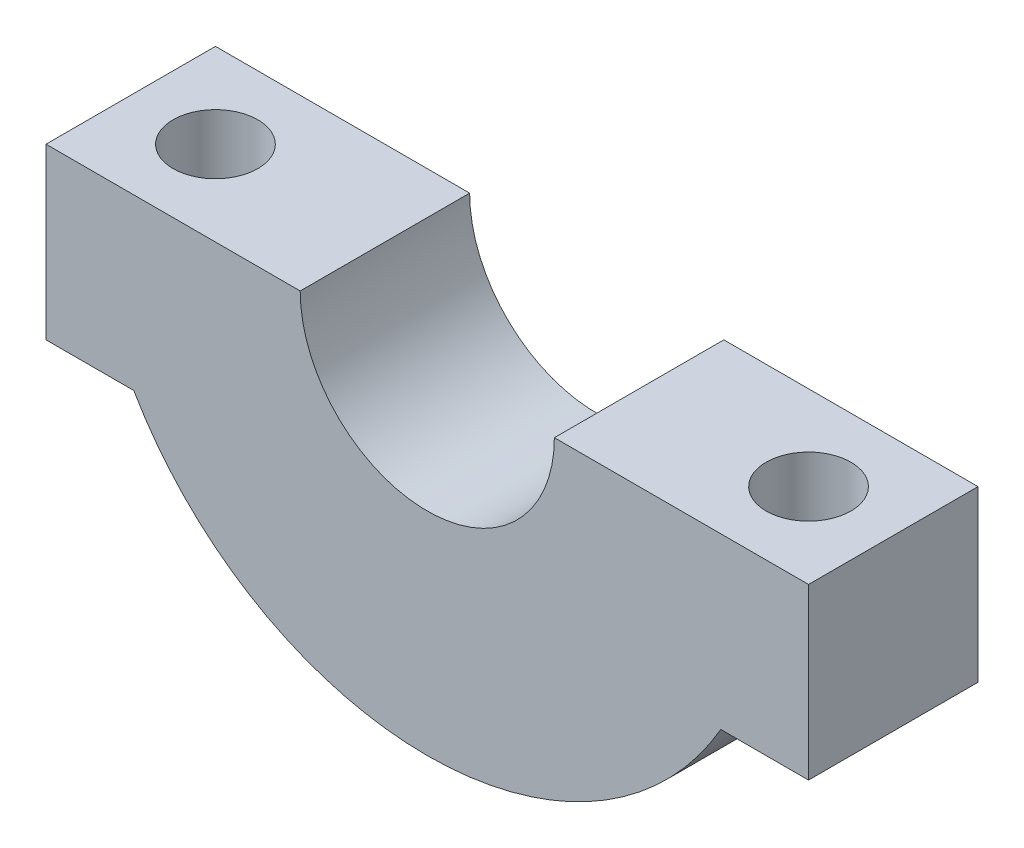
ISO-10303-21;
HEADER;
FILE_DESCRIPTION(('STEP AP214'),'2;1');
FILE_NAME('part.step','',(''),(''),'','','');
FILE_SCHEMA(('AUTOMOTIVE_DESIGN { 1 0 10303 214 1 1 1 1 }'));
ENDSEC;
DATA;
#1=APPLICATION_CONTEXT('core data for automotive mechanical design processes');
#2=APPLICATION_PROTOCOL_DEFINITION('international standard','automotive_design',2000,#1);
#3=PRODUCT_CONTEXT('',#1,'mechanical');
#4=PRODUCT('Part','Part','',(#3));
#5=PRODUCT_RELATED_PRODUCT_CATEGORY('part','',(#4));
#6=PRODUCT_DEFINITION_FORMATION('','',#4);
#7=PRODUCT_DEFINITION_CONTEXT('part definition',#1,'design');
#8=PRODUCT_DEFINITION('design','',#6,#7);
#9=PRODUCT_DEFINITION_SHAPE('','',#8);
#10=(LENGTH_UNIT() NAMED_UNIT(*) SI_UNIT(.MILLI.,.METRE.));
#11=(NAMED_UNIT(*) PLANE_ANGLE_UNIT() SI_UNIT($,.RADIAN.));
#12=(NAMED_UNIT(*) SI_UNIT($,.STERADIAN.) SOLID_ANGLE_UNIT());
#13=UNCERTAINTY_MEASURE_WITH_UNIT(LENGTH_MEASURE(1.E-05),#10,'distance_accuracy_value','');
#14=(GEOMETRIC_REPRESENTATION_CONTEXT(3) GLOBAL_UNCERTAINTY_ASSIGNED_CONTEXT((#13)) GLOBAL_UNIT_ASSIGNED_CONTEXT((#10,
#11,#12)) REPRESENTATION_CONTEXT('',''));
#15=CARTESIAN_POINT('',(0.,0.,0.));
#16=DIRECTION('',(0.,0.,1.));
#17=DIRECTION('',(1.,0.,0.));
#18=AXIS2_PLACEMENT_3D('',#15,#16,#17);
#19=CARTESIAN_POINT('',(45.,0.,20.));
#20=DIRECTION('',(-1.,0.,0.));
#21=DIRECTION('',(0.,0.,1.));
#22=AXIS2_PLACEMENT_3D('',#19,#20,#21);
#23=PLANE('',#22);
#24=DIRECTION('',(0.,1.,0.));
#25=VECTOR('',#24,1.);
#26=CARTESIAN_POINT('',(45.,0.,0.));
#27=LINE('',#26,#25);
#28=CARTESIAN_POINT('',(45.,-20.,0.));
#29=VERTEX_POINT('',#28);
#30=CARTESIAN_POINT('',(45.,0.,0.));
#31=VERTEX_POINT('',#30);
#32=EDGE_CURVE('E216',#29,#31,#27,.T.);
#33=ORIENTED_EDGE('',*,*,#32,.T.);
#34=DIRECTION('',(0.,0.,-1.));
#35=VECTOR('',#34,1.);
#36=CARTESIAN_POINT('',(45.,0.,20.));
#37=LINE('',#36,#35);
#38=CARTESIAN_POINT('',(45.,0.,20.));
#39=VERTEX_POINT('',#38);
#40=EDGE_CURVE('E174',#39,#31,#37,.T.);
#41=ORIENTED_EDGE('',*,*,#40,.F.);
#42=DIRECTION('',(0.,1.,0.));
#43=VECTOR('',#42,1.);
#44=CARTESIAN_POINT('',(45.,0.,20.));
#45=LINE('',#44,#43);
#46=CARTESIAN_POINT('',(45.,-20.,20.));
#47=VERTEX_POINT('',#46);
#48=EDGE_CURVE('E246',#47,#39,#45,.T.);
#49=ORIENTED_EDGE('',*,*,#48,.F.);
#50=DIRECTION('',(0.,0.,-1.));
#51=VECTOR('',#50,1.);
#52=CARTESIAN_POINT('',(45.,-20.,20.));
#53=LINE('',#52,#51);
#54=EDGE_CURVE('E144',#47,#29,#53,.T.);
#55=ORIENTED_EDGE('',*,*,#54,.T.);
#56=EDGE_LOOP('',(#33,#41,#49,#55));
#57=FACE_BOUND('',#56,.T.);
#58=ADVANCED_FACE('F45',(#57),#23,.F.);
#59=CARTESIAN_POINT('',(15.,0.,20.));
#60=DIRECTION('',(0.,-1.,0.));
#61=DIRECTION('',(0.,0.,-1.));
#62=AXIS2_PLACEMENT_3D('',#59,#60,#61);
#63=PLANE('',#62);
#64=CARTESIAN_POINT('',(35.,0.,10.));
#65=DIRECTION('',(0.,1.,0.));
#66=DIRECTION('',(0.,0.,1.));
#67=AXIS2_PLACEMENT_3D('',#64,#65,#66);
#68=CIRCLE('',#67,4.99999999999999);
#69=CARTESIAN_POINT('',(35.,0.,15.));
#70=VERTEX_POINT('',#69);
#71=EDGE_CURVE('E137',#70,#70,#68,.T.);
#72=ORIENTED_EDGE('',*,*,#71,.F.);
#73=EDGE_LOOP('',(#72));
#74=FACE_BOUND('',#73,.T.);
#75=DIRECTION('',(-1.,0.,0.));
#76=VECTOR('',#75,1.);
#77=CARTESIAN_POINT('',(15.,0.,0.));
#78=LINE('',#77,#76);
#79=CARTESIAN_POINT('',(15.,0.,0.));
#80=VERTEX_POINT('',#79);
#81=EDGE_CURVE('E220',#31,#80,#78,.T.);
#82=ORIENTED_EDGE('',*,*,#81,.T.);
#83=DIRECTION('',(0.,0.,-1.));
#84=VECTOR('',#83,1.);
#85=CARTESIAN_POINT('',(15.,0.,20.));
#86=LINE('',#85,#84);
#87=CARTESIAN_POINT('',(15.,0.,20.));
#88=VERTEX_POINT('',#87);
#89=EDGE_CURVE('E170',#88,#80,#86,.T.);
#90=ORIENTED_EDGE('',*,*,#89,.F.);
#91=DIRECTION('',(-1.,0.,0.));
#92=VECTOR('',#91,1.);
#93=CARTESIAN_POINT('',(15.,0.,20.));
#94=LINE('',#93,#92);
#95=EDGE_CURVE('E249',#39,#88,#94,.T.);
#96=ORIENTED_EDGE('',*,*,#95,.F.);
#97=ORIENTED_EDGE('',*,*,#40,.T.);
#98=EDGE_LOOP('',(#82,#90,#96,#97));
#99=FACE_BOUND('',#98,.T.);
#100=ADVANCED_FACE('F205',(#74,#99),#63,.F.);
#101=CARTESIAN_POINT('',(0.,0.,20.));
#102=DIRECTION('',(0.,0.,-1.));
#103=DIRECTION('',(-1.,0.,0.));
#104=AXIS2_PLACEMENT_3D('',#101,#102,#103);
#105=CYLINDRICAL_SURFACE('',#104,15.);
#106=CARTESIAN_POINT('',(0.,0.,0.));
#107=DIRECTION('',(0.,0.,-1.));
#108=DIRECTION('',(1.,0.,0.));
#109=AXIS2_PLACEMENT_3D('',#106,#107,#108);
#110=CIRCLE('',#109,15.);
#111=CARTESIAN_POINT('',(-15.,0.,0.));
#112=VERTEX_POINT('',#111);
#113=EDGE_CURVE('E224',#80,#112,#110,.T.);
#114=ORIENTED_EDGE('',*,*,#113,.T.);
#115=DIRECTION('',(0.,0.,-1.));
#116=VECTOR('',#115,1.);
#117=CARTESIAN_POINT('',(-15.,0.,20.));
#118=LINE('',#117,#116);
#119=CARTESIAN_POINT('',(-15.,0.,20.));
#120=VERTEX_POINT('',#119);
#121=EDGE_CURVE('E166',#120,#112,#118,.T.);
#122=ORIENTED_EDGE('',*,*,#121,.F.);
#123=CARTESIAN_POINT('',(0.,0.,20.));
#124=DIRECTION('',(0.,0.,-1.));
#125=DIRECTION('',(1.,0.,0.));
#126=AXIS2_PLACEMENT_3D('',#123,#124,#125);
#127=CIRCLE('',#126,15.);
#128=EDGE_CURVE('E252',#88,#120,#127,.T.);
#129=ORIENTED_EDGE('',*,*,#128,.F.);
#130=ORIENTED_EDGE('',*,*,#89,.T.);
#131=EDGE_LOOP('',(#114,#122,#129,#130));
#132=FACE_BOUND('',#131,.T.);
#133=ADVANCED_FACE('F211',(#132),#105,.F.);
#134=CARTESIAN_POINT('',(-15.,0.,20.));
#135=DIRECTION('',(0.,-1.,0.));
#136=DIRECTION('',(1.,0.,0.));
#137=AXIS2_PLACEMENT_3D('',#134,#135,#136);
#138=PLANE('',#137);
#139=CARTESIAN_POINT('',(-35.,0.,10.));
#140=DIRECTION('',(0.,1.,0.));
#141=DIRECTION('',(0.,0.,1.));
#142=AXIS2_PLACEMENT_3D('',#139,#140,#141);
#143=CIRCLE('',#142,4.99999999999999);
#144=CARTESIAN_POINT('',(-35.,0.,15.));
#145=VERTEX_POINT('',#144);
#146=EDGE_CURVE('E136',#145,#145,#143,.T.);
#147=ORIENTED_EDGE('',*,*,#146,.F.);
#148=EDGE_LOOP('',(#147));
#149=FACE_BOUND('',#148,.T.);
#150=DIRECTION('',(-1.,0.,0.));
#151=VECTOR('',#150,1.);
#152=CARTESIAN_POINT('',(-15.,0.,0.));
#153=LINE('',#152,#151);
#154=CARTESIAN_POINT('',(-45.,0.,0.));
#155=VERTEX_POINT('',#154);
#156=EDGE_CURVE('E232',#112,#155,#153,.T.);
#157=ORIENTED_EDGE('',*,*,#156,.T.);
#158=DIRECTION('',(0.,0.,-1.));
#159=VECTOR('',#158,1.);
#160=CARTESIAN_POINT('',(-45.,0.,20.));
#161=LINE('',#160,#159);
#162=CARTESIAN_POINT('',(-45.,0.,20.));
#163=VERTEX_POINT('',#162);
#164=EDGE_CURVE('E162',#163,#155,#161,.T.);
#165=ORIENTED_EDGE('',*,*,#164,.F.);
#166=DIRECTION('',(-1.,0.,0.));
#167=VECTOR('',#166,1.);
#168=CARTESIAN_POINT('',(-15.,0.,20.));
#169=LINE('',#168,#167);
#170=EDGE_CURVE('E258',#120,#163,#169,.T.);
#171=ORIENTED_EDGE('',*,*,#170,.F.);
#172=ORIENTED_EDGE('',*,*,#121,.T.);
#173=EDGE_LOOP('',(#157,#165,#171,#172));
#174=FACE_BOUND('',#173,.T.);
#175=ADVANCED_FACE('F284',(#149,#174),#138,.F.);
#176=CARTESIAN_POINT('',(-45.,0.,20.));
#177=DIRECTION('',(1.,0.,0.));
#178=DIRECTION('',(0.,0.,-1.));
#179=AXIS2_PLACEMENT_3D('',#176,#177,#178);
#180=PLANE('',#179);
#181=DIRECTION('',(0.,-1.,0.));
#182=VECTOR('',#181,1.);
#183=CARTESIAN_POINT('',(-45.,0.,0.));
#184=LINE('',#183,#182);
#185=CARTESIAN_POINT('',(-45.,-20.,0.));
#186=VERTEX_POINT('',#185);
#187=EDGE_CURVE('E235',#155,#186,#184,.T.);
#188=ORIENTED_EDGE('',*,*,#187,.T.);
#189=DIRECTION('',(0.,0.,-1.));
#190=VECTOR('',#189,1.);
#191=CARTESIAN_POINT('',(-45.,-20.,20.));
#192=LINE('',#191,#190);
#193=CARTESIAN_POINT('',(-45.,-20.,20.));
#194=VERTEX_POINT('',#193);
#195=EDGE_CURVE('E158',#194,#186,#192,.T.);
#196=ORIENTED_EDGE('',*,*,#195,.F.);
#197=DIRECTION('',(0.,-1.,0.));
#198=VECTOR('',#197,1.);
#199=CARTESIAN_POINT('',(-45.,0.,20.));
#200=LINE('',#199,#198);
#201=EDGE_CURVE('E261',#163,#194,#200,.T.);
#202=ORIENTED_EDGE('',*,*,#201,.F.);
#203=ORIENTED_EDGE('',*,*,#164,.T.);
#204=EDGE_LOOP('',(#188,#196,#202,#203));
#205=FACE_BOUND('',#204,.T.);
#206=ADVANCED_FACE('F279',(#205),#180,.F.);
#207=CARTESIAN_POINT('',(-39.4235163991571,-20.,20.));
#208=DIRECTION('',(0.,1.,0.));
#209=DIRECTION('',(0.,0.,1.));
#210=AXIS2_PLACEMENT_3D('',#207,#208,#209);
#211=PLANE('',#210);
#212=DIRECTION('',(0.,0.,-1.));
#213=VECTOR('',#212,1.);
#214=CARTESIAN_POINT('',(-34.6410161513775,-20.,20.));
#215=LINE('',#214,#213);
#216=CARTESIAN_POINT('',(-34.6410161513775,-20.,5.01290359062229));
#217=VERTEX_POINT('',#216);
#218=CARTESIAN_POINT('',(-34.6410161513775,-20.,0.));
#219=VERTEX_POINT('',#218);
#220=EDGE_CURVE('E148',#217,#219,#215,.T.);
#221=ORIENTED_EDGE('',*,*,#220,.F.);
#222=CARTESIAN_POINT('',(-35.,-20.,10.));
#223=DIRECTION('',(0.,1.,0.));
#224=DIRECTION('',(0.,0.,1.));
#225=AXIS2_PLACEMENT_3D('',#222,#223,#224);
#226=CIRCLE('',#225,4.99999999999999);
#227=CARTESIAN_POINT('',(-34.6410161513775,-20.,14.9870964093777));
#228=VERTEX_POINT('',#227);
#229=EDGE_CURVE('E71',#217,#228,#226,.T.);
#230=ORIENTED_EDGE('',*,*,#229,.T.);
#231=CARTESIAN_POINT('',(-34.6410161513775,-20.,20.));
#232=VERTEX_POINT('',#231);
#233=EDGE_CURVE('E154',#232,#228,#215,.T.);
#234=ORIENTED_EDGE('',*,*,#233,.F.);
#235=DIRECTION('',(1.,0.,0.));
#236=VECTOR('',#235,1.);
#237=CARTESIAN_POINT('',(-45.,-20.,20.));
#238=LINE('',#237,#236);
#239=EDGE_CURVE('E264',#194,#232,#238,.T.);
#240=ORIENTED_EDGE('',*,*,#239,.F.);
#241=ORIENTED_EDGE('',*,*,#195,.T.);
#242=DIRECTION('',(1.,0.,0.));
#243=VECTOR('',#242,1.);
#244=CARTESIAN_POINT('',(-39.4235163991571,-20.,0.));
#245=LINE('',#244,#243);
#246=EDGE_CURVE('E239',#186,#219,#245,.T.);
#247=ORIENTED_EDGE('',*,*,#246,.T.);
#248=EDGE_LOOP('',(#221,#230,#234,#240,#241,#247));
#249=FACE_BOUND('',#248,.T.);
#250=ADVANCED_FACE('F203',(#249),#211,.F.);
#251=CARTESIAN_POINT('',(0.,0.,20.));
#252=DIRECTION('',(0.,0.,-1.));
#253=DIRECTION('',(-1.,0.,0.));
#254=AXIS2_PLACEMENT_3D('',#251,#252,#253);
#255=CYLINDRICAL_SURFACE('',#254,40.);
#256=DIRECTION('',(0.,0.,-1.));
#257=VECTOR('',#256,1.);
#258=CARTESIAN_POINT('',(34.6410161513775,-20.,20.));
#259=LINE('',#258,#257);
#260=CARTESIAN_POINT('',(34.6410161513775,-20.,5.0129035906223));
#261=VERTEX_POINT('',#260);
#262=CARTESIAN_POINT('',(34.6410161513775,-20.,0.));
#263=VERTEX_POINT('',#262);
#264=EDGE_CURVE('E131',#261,#263,#259,.T.);
#265=ORIENTED_EDGE('',*,*,#264,.F.);
#266=CARTESIAN_POINT('',(34.6410161513775,-20.,5.0129035906223));
#267=CARTESIAN_POINT('',(34.5569974337862,-20.1455256810058,5.01895620301188));
#268=CARTESIAN_POINT('',(34.4721031356645,-20.2904475163682,5.02719631173944));
#269=CARTESIAN_POINT('',(34.3006350975074,-20.5789845314845,5.04839798513965));
#270=CARTESIAN_POINT('',(34.2140610164026,-20.7225994369918,5.06136051837274));
#271=CARTESIAN_POINT('',(33.9514230225617,-21.1521553385523,5.10794531441655));
#272=CARTESIAN_POINT('',(33.7729793044319,-21.4358794714519,5.14923073759398));
#273=CARTESIAN_POINT('',(33.4084446901606,-21.999777477509,5.2562063521439));
#274=CARTESIAN_POINT('',(33.2222800399063,-22.2798383427319,5.32224541402007));
#275=CARTESIAN_POINT('',(32.8470701745811,-22.8293731691943,5.48264760919001));
#276=CARTESIAN_POINT('',(32.6580297704082,-23.0988625820413,5.57696751807977));
#277=CARTESIAN_POINT('',(32.371911259652,-23.4965359624846,5.74490609897557));
#278=CARTESIAN_POINT('',(32.2747231593386,-23.6298299802146,5.80635935201146));
#279=CARTESIAN_POINT('',(32.0810158283324,-23.8921529260806,5.93880463349413));
#280=CARTESIAN_POINT('',(31.9844966467715,-24.0211815434935,6.00979735496615));
#281=CARTESIAN_POINT('',(31.7932046396151,-24.2737956168747,6.16185678667682));
#282=CARTESIAN_POINT('',(31.6984273843673,-24.3973964787673,6.24289210052549));
#283=CARTESIAN_POINT('',(31.5113345701699,-24.6385698483635,6.41594536982061));
#284=CARTESIAN_POINT('',(31.4190185317041,-24.7561435345159,6.50796116653608));
#285=CARTESIAN_POINT('',(31.1801464360225,-25.0570372081448,6.76634769253465));
#286=CARTESIAN_POINT('',(31.0365839118807,-25.2344165322596,6.94268749943616));
#287=CARTESIAN_POINT('',(30.7663671528527,-25.5631743528159,7.32945172027542));
#288=CARTESIAN_POINT('',(30.6396909958046,-25.7145866347804,7.53983114174512));
#289=CARTESIAN_POINT('',(30.4413014116088,-25.9488841750416,7.93739708214585));
#290=CARTESIAN_POINT('',(30.3637800637895,-26.0394244947128,8.11708468771985));
#291=CARTESIAN_POINT('',(30.2621078898743,-26.1573608043123,8.39924706328396));
#292=CARTESIAN_POINT('',(30.2306458711862,-26.1937009900317,8.49543295850673));
#293=CARTESIAN_POINT('',(30.1731561169815,-26.2599042757422,8.691564423023));
#294=CARTESIAN_POINT('',(30.1471259802855,-26.2897702379106,8.79150830792841));
#295=CARTESIAN_POINT('',(30.1008315116267,-26.3427635999965,8.99542420294297));
#296=CARTESIAN_POINT('',(30.0806176531251,-26.365832050522,9.09942307440334));
#297=CARTESIAN_POINT('',(30.0467201426443,-26.4044555136034,9.30980949853528));
#298=CARTESIAN_POINT('',(30.0330333044884,-26.4200141921131,9.41619585913822));
#299=CARTESIAN_POINT('',(30.0125145934293,-26.4433207162895,9.63045040345366));
#300=CARTESIAN_POINT('',(30.0056808380788,-26.4510707068977,9.73831817198674));
#301=CARTESIAN_POINT('',(29.9990370656684,-26.4586054336613,9.95454046532022));
#302=CARTESIAN_POINT('',(29.9992262768106,-26.4583910450723,10.0628949353254));
#303=CARTESIAN_POINT('',(30.0061745732481,-26.4505105681634,10.2659799046857));
#304=CARTESIAN_POINT('',(30.0121368778374,-26.4437482033277,10.360774282681));
#305=CARTESIAN_POINT('',(30.0293574962306,-26.4241906001357,10.5492618207242));
#306=CARTESIAN_POINT('',(30.0406174549562,-26.4113934879876,10.6429546294669));
#307=CARTESIAN_POINT('',(30.0820505175927,-26.3642192884699,10.9213290712801));
#308=CARTESIAN_POINT('',(30.119883807607,-26.321051548606,11.1034945868281));
#309=CARTESIAN_POINT('',(30.2139082878683,-26.2130662218428,11.4586201711679));
#310=CARTESIAN_POINT('',(30.2703153361085,-26.147993858402,11.6314427552713));
#311=CARTESIAN_POINT('',(30.3980253325439,-25.99941682067,11.9630160572011));
#312=CARTESIAN_POINT('',(30.4693352916676,-25.9159034699467,12.1217601016723));
#313=CARTESIAN_POINT('',(30.6636589886012,-25.6860410842791,12.502521226755));
#314=CARTESIAN_POINT('',(30.7942858929349,-25.5295894365114,12.7145586084219));
#315=CARTESIAN_POINT('',(31.0724375671902,-25.1903132514413,13.1035006662183));
#316=CARTESIAN_POINT('',(31.2199964823707,-25.0074352229207,13.2803323112859));
#317=CARTESIAN_POINT('',(31.4867278512688,-24.6702289253179,13.5615368136127));
#318=CARTESIAN_POINT('',(31.6038627552571,-24.5200707218646,13.6730029400516));
#319=CARTESIAN_POINT('',(31.8413359369251,-24.2108923599957,13.8791212532048));
#320=CARTESIAN_POINT('',(31.9616759199513,-24.0518674325353,13.9737642745978));
#321=CARTESIAN_POINT('',(32.2042830165241,-23.7260533542218,14.1480560422729));
#322=CARTESIAN_POINT('',(32.3265561121862,-23.559234321807,14.2276399538448));
#323=CARTESIAN_POINT('',(32.5712816305794,-23.219720950116,14.3728216790787));
#324=CARTESIAN_POINT('',(32.6937340947143,-23.0470249379268,14.4384154711054));
#325=CARTESIAN_POINT('',(32.9752921014564,-22.6430534316041,14.5751525927619));
#326=CARTESIAN_POINT('',(33.1341126011784,-22.4100661719563,14.6418206215043));
#327=CARTESIAN_POINT('',(33.4488794628233,-21.9374835679198,14.756267309898));
#328=CARTESIAN_POINT('',(33.604823947847,-21.6978841464272,14.8040340233055));
#329=CARTESIAN_POINT('',(33.9102574901219,-21.2173089601665,14.8823061672692));
#330=CARTESIAN_POINT('',(34.0598097600945,-20.9764156268176,14.9130739315711));
#331=CARTESIAN_POINT('',(34.2805709833345,-20.6121951851089,14.9485310537963));
#332=CARTESIAN_POINT('',(34.3535102888989,-20.4904004916039,14.9585641562319));
#333=CARTESIAN_POINT('',(34.4981807857006,-20.2458810786139,14.9752863868722));
#334=CARTESIAN_POINT('',(34.5699120813614,-20.1231564408593,14.9819758055622));
#335=CARTESIAN_POINT('',(34.6410161513775,-20.,14.9870964093777));
#336=B_SPLINE_CURVE_WITH_KNOTS('',3,(#266,#267,#268,#269,#270,#271,#272,#273,#274,#275,#276,
#277,#278,#279,#280,#281,#282,#283,#284,#285,#286,#287,#288,#289,#290,#291,#292,#293,#294,#295,
#296,#297,#298,#299,#300,#301,#302,#303,#304,#305,#306,#307,#308,#309,#310,#311,#312,#313,#314,
#315,#316,#317,#318,#319,#320,#321,#322,#323,#324,#325,#326,#327,#328,#329,#330,#331,#332,#333,
#334,#335),.UNSPECIFIED.,.F.,.F.,(4,2,2,2,2,2,2,2,2,2,2,2,2,2,2,2,2,2,2,2,2,2,2,2,2,2,2,2,2,2,2,
2,2,2,4),(0.,0.504406007676731,1.00891552637718,2.02114548392109,3.04821340086129,
4.0737194818543,4.60157825060639,5.12947538810371,5.65576192111485,6.18194515765688,
7.04401514602057,7.90495484910452,8.54910838206061,8.87135248715114,9.19345384010641,
9.5182714365942,9.84293031007226,10.1674999797972,10.4920339806348,10.777345690913,
11.0627460489994,11.6329894932304,12.2101089073229,12.7875004352259,13.6648931942039,
14.5440874822723,15.2052037450276,15.8666790909803,16.5309405613255,17.1953927253625,
18.063771603507,18.9326984519458,19.7878118334808,20.2147302091756,20.6416114895286),.UNSPECIFIED.);
#337=CARTESIAN_POINT('',(34.6410161513775,-20.,14.9870964093777));
#338=VERTEX_POINT('',#337);
#339=EDGE_CURVE('E11',#261,#338,#336,.T.);
#340=ORIENTED_EDGE('',*,*,#339,.T.);
#341=CARTESIAN_POINT('',(34.6410161513775,-20.,20.));
#342=VERTEX_POINT('',#341);
#343=EDGE_CURVE('E134',#342,#338,#259,.T.);
#344=ORIENTED_EDGE('',*,*,#343,.F.);
#345=CARTESIAN_POINT('',(0.,0.,20.));
#346=DIRECTION('',(0.,0.,1.));
#347=DIRECTION('',(1.,0.,0.));
#348=AXIS2_PLACEMENT_3D('',#345,#346,#347);
#349=CIRCLE('',#348,40.);
#350=EDGE_CURVE('E266',#232,#342,#349,.T.);
#351=ORIENTED_EDGE('',*,*,#350,.F.);
#352=ORIENTED_EDGE('',*,*,#233,.T.);
#353=CARTESIAN_POINT('',(-34.6410161513775,-20.,14.9870964093777));
#354=CARTESIAN_POINT('',(-34.5569974337862,-20.1455256810058,14.9810437969881));
#355=CARTESIAN_POINT('',(-34.4721031356644,-20.2904475163682,14.9728036882606));
#356=CARTESIAN_POINT('',(-34.3006350975074,-20.5789845314845,14.9516020148604));
#357=CARTESIAN_POINT('',(-34.2140610164026,-20.7225994369918,14.9386394816273));
#358=CARTESIAN_POINT('',(-33.9514230225616,-21.1521553385523,14.8920546855835));
#359=CARTESIAN_POINT('',(-33.7729793044318,-21.4358794714519,14.850769262406));
#360=CARTESIAN_POINT('',(-33.4084446901606,-21.999777477509,14.7437936478561));
#361=CARTESIAN_POINT('',(-33.2222800399063,-22.2798383427319,14.6777545859799));
#362=CARTESIAN_POINT('',(-32.8470701745811,-22.8293731691943,14.51735239081));
#363=CARTESIAN_POINT('',(-32.6580297704082,-23.0988625820413,14.4230324819202));
#364=CARTESIAN_POINT('',(-32.371911259652,-23.4965359624846,14.2550939010245));
#365=CARTESIAN_POINT('',(-32.2747231593386,-23.6298299802146,14.1936406479886));
#366=CARTESIAN_POINT('',(-32.0810158283324,-23.8921529260806,14.0611953665059));
#367=CARTESIAN_POINT('',(-31.9844966467715,-24.0211815434935,13.9902026450339));
#368=CARTESIAN_POINT('',(-31.7932046396151,-24.2737956168747,13.8381432133232));
#369=CARTESIAN_POINT('',(-31.6984273843672,-24.3973964787673,13.7571078994745));
#370=CARTESIAN_POINT('',(-31.5113345701699,-24.6385698483635,13.5840546301794));
#371=CARTESIAN_POINT('',(-31.4190185317041,-24.7561435345159,13.4920388334639));
#372=CARTESIAN_POINT('',(-31.1801464360225,-25.0570372081448,13.2336523074654));
#373=CARTESIAN_POINT('',(-31.0365839118807,-25.2344165322596,13.0573125005639));
#374=CARTESIAN_POINT('',(-30.7663671528527,-25.563174352816,12.6705482797246));
#375=CARTESIAN_POINT('',(-30.6396909958046,-25.7145866347805,12.4601688582549));
#376=CARTESIAN_POINT('',(-30.4413014116088,-25.9488841750416,12.0626029178542));
#377=CARTESIAN_POINT('',(-30.3637800637895,-26.0394244947128,11.8829153122802));
#378=CARTESIAN_POINT('',(-30.2621078898743,-26.1573608043123,11.6007529367161));
#379=CARTESIAN_POINT('',(-30.2306458711862,-26.1937009900317,11.5045670414933));
#380=CARTESIAN_POINT('',(-30.1731561169815,-26.2599042757422,11.308435576977));
#381=CARTESIAN_POINT('',(-30.1471259802855,-26.2897702379106,11.2084916920716));
#382=CARTESIAN_POINT('',(-30.1008315116267,-26.3427635999964,11.004575797057));
#383=CARTESIAN_POINT('',(-30.0806176531251,-26.365832050522,10.9005769255967));
#384=CARTESIAN_POINT('',(-30.0467201426443,-26.4044555136034,10.6901905014647));
#385=CARTESIAN_POINT('',(-30.0330333044884,-26.4200141921131,10.5838041408618));
#386=CARTESIAN_POINT('',(-30.0125145934293,-26.4433207162895,10.3695495965463));
#387=CARTESIAN_POINT('',(-30.0056808380788,-26.4510707068977,10.2616818280133));
#388=CARTESIAN_POINT('',(-29.9990370656684,-26.4586054336613,10.0454595346798));
#389=CARTESIAN_POINT('',(-29.9992262768106,-26.4583910450723,9.93710506467465));
#390=CARTESIAN_POINT('',(-30.0061745732481,-26.4505105681634,9.73402009531431));
#391=CARTESIAN_POINT('',(-30.0121368778374,-26.4437482033277,9.63922571731903));
#392=CARTESIAN_POINT('',(-30.0293574962306,-26.4241906001357,9.45073817927577));
#393=CARTESIAN_POINT('',(-30.0406174549562,-26.4113934879876,9.35704537053308));
#394=CARTESIAN_POINT('',(-30.0820505175927,-26.3642192884699,9.07867092871991));
#395=CARTESIAN_POINT('',(-30.119883807607,-26.321051548606,8.89650541317187));
#396=CARTESIAN_POINT('',(-30.2139082878683,-26.2130662218428,8.54137982883213));
#397=CARTESIAN_POINT('',(-30.2703153361085,-26.147993858402,8.36855724472866));
#398=CARTESIAN_POINT('',(-30.3980253325439,-25.9994168206699,8.03698394279895));
#399=CARTESIAN_POINT('',(-30.4693352916676,-25.9159034699467,7.87823989832774));
#400=CARTESIAN_POINT('',(-30.6636589886012,-25.6860410842791,7.49747877324504));
#401=CARTESIAN_POINT('',(-30.7942858929349,-25.5295894365114,7.28544139157815));
#402=CARTESIAN_POINT('',(-31.0724375671902,-25.1903132514413,6.89649933378172));
#403=CARTESIAN_POINT('',(-31.2199964823707,-25.0074352229207,6.71966768871406));
#404=CARTESIAN_POINT('',(-31.4867278512688,-24.6702289253179,6.43846318638735));
#405=CARTESIAN_POINT('',(-31.6038627552571,-24.5200707218646,6.32699705994846));
#406=CARTESIAN_POINT('',(-31.8413359369251,-24.2108923599956,6.12087874679521));
#407=CARTESIAN_POINT('',(-31.9616759199513,-24.0518674325353,6.02623572540226));
#408=CARTESIAN_POINT('',(-32.2042830165242,-23.7260533542218,5.85194395772716));
#409=CARTESIAN_POINT('',(-32.3265561121862,-23.5592343218069,5.77236004615522));
#410=CARTESIAN_POINT('',(-32.5712816305794,-23.2197209501159,5.62717832092131));
#411=CARTESIAN_POINT('',(-32.6937340947144,-23.0470249379268,5.56158452889461));
#412=CARTESIAN_POINT('',(-32.9752921014564,-22.6430534316041,5.42484740723808));
#413=CARTESIAN_POINT('',(-33.1341126011784,-22.4100661719563,5.35817937849568));
#414=CARTESIAN_POINT('',(-33.4488794628233,-21.9374835679198,5.24373269010197));
#415=CARTESIAN_POINT('',(-33.604823947847,-21.6978841464272,5.19596597669455));
#416=CARTESIAN_POINT('',(-33.9102574901219,-21.2173089601665,5.11769383273079));
#417=CARTESIAN_POINT('',(-34.0598097600946,-20.9764156268176,5.08692606842893));
#418=CARTESIAN_POINT('',(-34.2805709833345,-20.6121951851089,5.05146894620373));
#419=CARTESIAN_POINT('',(-34.3535102888989,-20.4904004916039,5.04143584376811));
#420=CARTESIAN_POINT('',(-34.4981807857006,-20.2458810786139,5.02471361312783));
#421=CARTESIAN_POINT('',(-34.5699120813614,-20.1231564408593,5.01802419443783));
#422=CARTESIAN_POINT('',(-34.6410161513775,-20.,5.01290359062229));
#423=B_SPLINE_CURVE_WITH_KNOTS('',3,(#353,#354,#355,#356,#357,#358,#359,#360,#361,#362,#363,
#364,#365,#366,#367,#368,#369,#370,#371,#372,#373,#374,#375,#376,#377,#378,#379,#380,#381,#382,
#383,#384,#385,#386,#387,#388,#389,#390,#391,#392,#393,#394,#395,#396,#397,#398,#399,#400,#401,
#402,#403,#404,#405,#406,#407,#408,#409,#410,#411,#412,#413,#414,#415,#416,#417,#418,#419,#420,
#421,#422),.UNSPECIFIED.,.F.,.F.,(4,2,2,2,2,2,2,2,2,2,2,2,2,2,2,2,2,2,2,2,2,2,2,2,2,2,2,2,2,2,2,
2,2,2,4),(0.,0.504406007676738,1.00891552637719,2.02114548392109,3.04821340086129,
4.0737194818543,4.60157825060638,5.12947538810371,5.65576192111485,6.18194515765688,
7.04401514602057,7.90495484910451,8.54910838206061,8.87135248715114,9.19345384010641,
9.5182714365942,9.84293031007226,10.1674999797972,10.4920339806348,10.777345690913,
11.0627460489994,11.6329894932304,12.2101089073229,12.7875004352259,13.6648931942039,
14.5440874822723,15.2052037450276,15.8666790909803,16.5309405613256,17.1953927253626,
18.0637716035071,18.9326984519458,19.7878118334808,20.2147302091755,20.6416114895285),.UNSPECIFIED.);
#424=EDGE_CURVE('E59',#228,#217,#423,.T.);
#425=ORIENTED_EDGE('',*,*,#424,.T.);
#426=ORIENTED_EDGE('',*,*,#220,.T.);
#427=CARTESIAN_POINT('',(0.,0.,0.));
#428=DIRECTION('',(0.,0.,1.));
#429=DIRECTION('',(1.,0.,0.));
#430=AXIS2_PLACEMENT_3D('',#427,#428,#429);
#431=CIRCLE('',#430,40.);
#432=EDGE_CURVE('E142',#219,#263,#431,.T.);
#433=ORIENTED_EDGE('',*,*,#432,.T.);
#434=EDGE_LOOP('',(#265,#340,#344,#351,#352,#425,#426,#433));
#435=FACE_BOUND('',#434,.T.);
#436=ADVANCED_FACE('F140',(#435),#255,.T.);
#437=CARTESIAN_POINT('',(45.,-20.,20.));
#438=DIRECTION('',(0.,1.,0.));
#439=DIRECTION('',(0.,0.,1.));
#440=AXIS2_PLACEMENT_3D('',#437,#438,#439);
#441=PLANE('',#440);
#442=ORIENTED_EDGE('',*,*,#343,.T.);
#443=CARTESIAN_POINT('',(35.,-20.,10.));
#444=DIRECTION('',(0.,1.,0.));
#445=DIRECTION('',(0.,0.,1.));
#446=AXIS2_PLACEMENT_3D('',#443,#444,#445);
#447=CIRCLE('',#446,4.99999999999999);
#448=EDGE_CURVE('E65',#338,#261,#447,.T.);
#449=ORIENTED_EDGE('',*,*,#448,.T.);
#450=ORIENTED_EDGE('',*,*,#264,.T.);
#451=DIRECTION('',(1.,0.,0.));
#452=VECTOR('',#451,1.);
#453=CARTESIAN_POINT('',(45.,-20.,0.));
#454=LINE('',#453,#452);
#455=EDGE_CURVE('E244',#263,#29,#454,.T.);
#456=ORIENTED_EDGE('',*,*,#455,.T.);
#457=ORIENTED_EDGE('',*,*,#54,.F.);
#458=DIRECTION('',(1.,0.,0.));
#459=VECTOR('',#458,1.);
#460=CARTESIAN_POINT('',(34.6410161513775,-20.,20.));
#461=LINE('',#460,#459);
#462=EDGE_CURVE('E150',#342,#47,#461,.T.);
#463=ORIENTED_EDGE('',*,*,#462,.F.);
#464=EDGE_LOOP('',(#442,#449,#450,#456,#457,#463));
#465=FACE_BOUND('',#464,.T.);
#466=ADVANCED_FACE('F130',(#465),#441,.F.);
#467=CARTESIAN_POINT('',(0.,0.,20.));
#468=DIRECTION('',(0.,0.,1.));
#469=DIRECTION('',(1.,0.,0.));
#470=AXIS2_PLACEMENT_3D('',#467,#468,#469);
#471=PLANE('',#470);
#472=ORIENTED_EDGE('',*,*,#48,.T.);
#473=ORIENTED_EDGE('',*,*,#95,.T.);
#474=ORIENTED_EDGE('',*,*,#128,.T.);
#475=ORIENTED_EDGE('',*,*,#170,.T.);
#476=ORIENTED_EDGE('',*,*,#201,.T.);
#477=ORIENTED_EDGE('',*,*,#239,.T.);
#478=ORIENTED_EDGE('',*,*,#350,.T.);
#479=ORIENTED_EDGE('',*,*,#462,.T.);
#480=EDGE_LOOP('',(#472,#473,#474,#475,#476,#477,#478,#479));
#481=FACE_BOUND('',#480,.T.);
#482=ADVANCED_FACE('F193',(#481),#471,.T.);
#483=CARTESIAN_POINT('',(0.,0.,0.));
#484=DIRECTION('',(0.,0.,1.));
#485=DIRECTION('',(1.,0.,0.));
#486=AXIS2_PLACEMENT_3D('',#483,#484,#485);
#487=PLANE('',#486);
#488=ORIENTED_EDGE('',*,*,#32,.F.);
#489=ORIENTED_EDGE('',*,*,#455,.F.);
#490=ORIENTED_EDGE('',*,*,#432,.F.);
#491=ORIENTED_EDGE('',*,*,#246,.F.);
#492=ORIENTED_EDGE('',*,*,#187,.F.);
#493=ORIENTED_EDGE('',*,*,#156,.F.);
#494=ORIENTED_EDGE('',*,*,#113,.F.);
#495=ORIENTED_EDGE('',*,*,#81,.F.);
#496=EDGE_LOOP('',(#488,#489,#490,#491,#492,#493,#494,#495));
#497=FACE_BOUND('',#496,.T.);
#498=ADVANCED_FACE('F190',(#497),#487,.F.);
#499=CARTESIAN_POINT('',(-35.,0.,10.));
#500=DIRECTION('',(0.,1.,0.));
#501=DIRECTION('',(0.,0.,1.));
#502=AXIS2_PLACEMENT_3D('',#499,#500,#501);
#503=CYLINDRICAL_SURFACE('',#502,4.99999999999999);
#504=ORIENTED_EDGE('',*,*,#146,.T.);
#505=EDGE_LOOP('',(#504));
#506=FACE_BOUND('',#505,.T.);
#507=ORIENTED_EDGE('',*,*,#424,.F.);
#508=ORIENTED_EDGE('',*,*,#229,.F.);
#509=EDGE_LOOP('',(#507,#508));
#510=FACE_BOUND('',#509,.T.);
#511=ADVANCED_FACE('F186',(#506,#510),#503,.F.);
#512=CARTESIAN_POINT('',(35.,0.,10.));
#513=DIRECTION('',(0.,1.,0.));
#514=DIRECTION('',(0.,0.,1.));
#515=AXIS2_PLACEMENT_3D('',#512,#513,#514);
#516=CYLINDRICAL_SURFACE('',#515,4.99999999999999);
#517=ORIENTED_EDGE('',*,*,#71,.T.);
#518=EDGE_LOOP('',(#517));
#519=FACE_BOUND('',#518,.T.);
#520=ORIENTED_EDGE('',*,*,#339,.F.);
#521=ORIENTED_EDGE('',*,*,#448,.F.);
#522=EDGE_LOOP('',(#520,#521));
#523=FACE_BOUND('',#522,.T.);
#524=ADVANCED_FACE('F124',(#519,#523),#516,.F.);
#525=CLOSED_SHELL('',(#58,#100,#133,#175,#206,#250,#436,#466,#482,#498,#511,#524));
#526=MANIFOLD_SOLID_BREP('B2',#525);
#527=ADVANCED_BREP_SHAPE_REPRESENTATION('',(#18,#526),#14);
#528=SHAPE_DEFINITION_REPRESENTATION(#9,#527);
ENDSEC;
END-ISO-10303-21;
